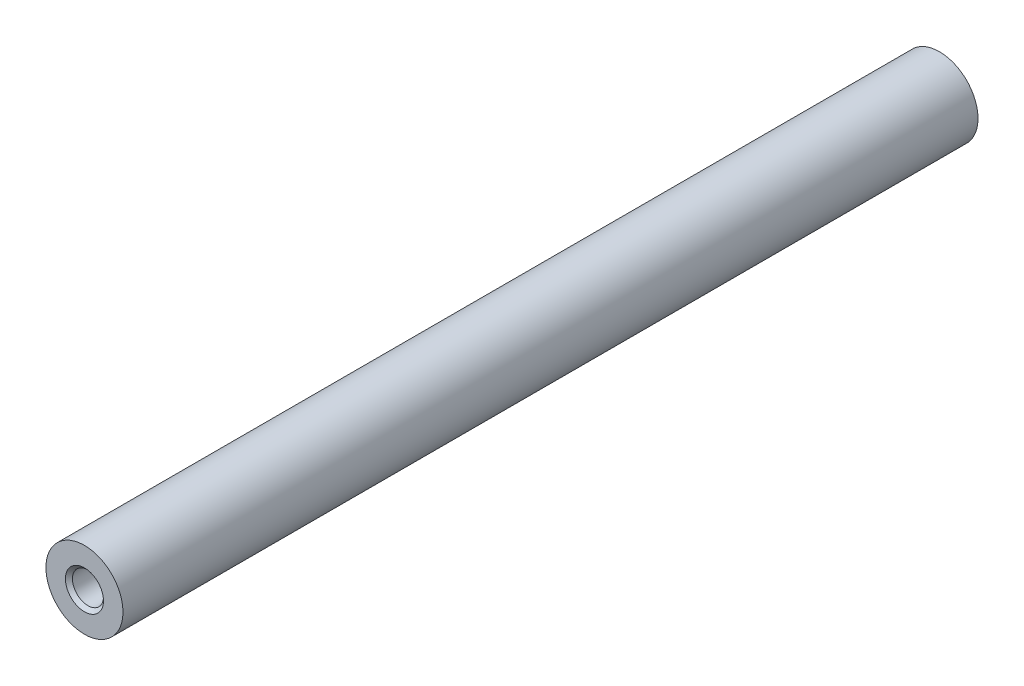
ISO-10303-21;
HEADER;
FILE_DESCRIPTION(('STEP AP214'),'2;1');
FILE_NAME('part.step','',(''),(''),'','','');
FILE_SCHEMA(('AUTOMOTIVE_DESIGN { 1 0 10303 214 1 1 1 1 }'));
ENDSEC;
DATA;
#1=APPLICATION_CONTEXT('core data for automotive mechanical design processes');
#2=APPLICATION_PROTOCOL_DEFINITION('international standard','automotive_design',2000,#1);
#3=PRODUCT_CONTEXT('',#1,'mechanical');
#4=PRODUCT('Part','Part','',(#3));
#5=PRODUCT_RELATED_PRODUCT_CATEGORY('part','',(#4));
#6=PRODUCT_DEFINITION_FORMATION('','',#4);
#7=PRODUCT_DEFINITION_CONTEXT('part definition',#1,'design');
#8=PRODUCT_DEFINITION('design','',#6,#7);
#9=PRODUCT_DEFINITION_SHAPE('','',#8);
#10=(LENGTH_UNIT() NAMED_UNIT(*) SI_UNIT(.MILLI.,.METRE.));
#11=(NAMED_UNIT(*) PLANE_ANGLE_UNIT() SI_UNIT($,.RADIAN.));
#12=(NAMED_UNIT(*) SI_UNIT($,.STERADIAN.) SOLID_ANGLE_UNIT());
#13=UNCERTAINTY_MEASURE_WITH_UNIT(LENGTH_MEASURE(1.E-05),#10,'distance_accuracy_value','');
#14=(GEOMETRIC_REPRESENTATION_CONTEXT(3) GLOBAL_UNCERTAINTY_ASSIGNED_CONTEXT((#13)) GLOBAL_UNIT_ASSIGNED_CONTEXT((#10,
#11,#12)) REPRESENTATION_CONTEXT('',''));
#15=CARTESIAN_POINT('',(0.,0.,0.));
#16=DIRECTION('',(0.,0.,1.));
#17=DIRECTION('',(1.,0.,0.));
#18=AXIS2_PLACEMENT_3D('',#15,#16,#17);
#19=CARTESIAN_POINT('',(-29.0717121826814,179.873872766802,-91.));
#20=DIRECTION('',(0.,0.,-1.));
#21=DIRECTION('',(1.,0.,0.));
#22=AXIS2_PLACEMENT_3D('',#19,#20,#21);
#23=PLANE('',#22);
#24=CARTESIAN_POINT('',(-29.0717121826814,179.873872766802,-91.));
#25=DIRECTION('',(0.,0.,-1.));
#26=DIRECTION('',(-1.,0.,0.));
#27=AXIS2_PLACEMENT_3D('',#24,#25,#26);
#28=CIRCLE('',#27,2.025);
#29=CARTESIAN_POINT('',(-31.0967121826814,179.873872766802,-91.));
#30=VERTEX_POINT('',#29);
#31=EDGE_CURVE('E66',#30,#30,#28,.T.);
#32=ORIENTED_EDGE('',*,*,#31,.F.);
#33=EDGE_LOOP('',(#32));
#34=FACE_BOUND('',#33,.T.);
#35=CARTESIAN_POINT('',(-29.0717121826814,179.873872766802,-91.));
#36=DIRECTION('',(0.,0.,-1.));
#37=DIRECTION('',(-1.,0.,0.));
#38=AXIS2_PLACEMENT_3D('',#35,#36,#37);
#39=CIRCLE('',#38,4.09999999999999);
#40=CARTESIAN_POINT('',(-33.1717121826814,179.873872766802,-91.));
#41=VERTEX_POINT('',#40);
#42=EDGE_CURVE('E11',#41,#41,#39,.F.);
#43=ORIENTED_EDGE('',*,*,#42,.F.);
#44=EDGE_LOOP('',(#43));
#45=FACE_BOUND('',#44,.T.);
#46=ADVANCED_FACE('F36',(#34,#45),#23,.T.);
#47=CARTESIAN_POINT('',(-29.0717121826814,179.873872766802,0.));
#48=DIRECTION('',(0.,0.,1.));
#49=DIRECTION('',(1.,0.,0.));
#50=AXIS2_PLACEMENT_3D('',#47,#48,#49);
#51=PLANE('',#50);
#52=CARTESIAN_POINT('',(-29.0717121826814,179.873872766802,0.));
#53=DIRECTION('',(0.,0.,1.));
#54=DIRECTION('',(1.,0.,0.));
#55=AXIS2_PLACEMENT_3D('',#52,#53,#54);
#56=CIRCLE('',#55,2.025);
#57=CARTESIAN_POINT('',(-27.0467121826814,179.873872766802,0.));
#58=VERTEX_POINT('',#57);
#59=EDGE_CURVE('E59',#58,#58,#56,.T.);
#60=ORIENTED_EDGE('',*,*,#59,.F.);
#61=EDGE_LOOP('',(#60));
#62=FACE_BOUND('',#61,.T.);
#63=CARTESIAN_POINT('',(-29.0717121826814,179.873872766802,0.));
#64=DIRECTION('',(0.,0.,1.));
#65=DIRECTION('',(1.,0.,0.));
#66=AXIS2_PLACEMENT_3D('',#63,#64,#65);
#67=CIRCLE('',#66,4.09999999999999);
#68=CARTESIAN_POINT('',(-24.9717121826814,179.873872766802,0.));
#69=VERTEX_POINT('',#68);
#70=EDGE_CURVE('E43',#69,#69,#67,.T.);
#71=ORIENTED_EDGE('',*,*,#70,.T.);
#72=EDGE_LOOP('',(#71));
#73=FACE_BOUND('',#72,.T.);
#74=ADVANCED_FACE('F77',(#62,#73),#51,.T.);
#75=CARTESIAN_POINT('',(-29.0717121826814,179.873872766802,-102.596551211459));
#76=DIRECTION('',(0.,0.,1.));
#77=DIRECTION('',(1.,0.,0.));
#78=AXIS2_PLACEMENT_3D('',#75,#76,#77);
#79=CYLINDRICAL_SURFACE('',#78,4.09999999999999);
#80=ORIENTED_EDGE('',*,*,#70,.F.);
#81=EDGE_LOOP('',(#80));
#82=FACE_BOUND('',#81,.T.);
#83=ORIENTED_EDGE('',*,*,#42,.T.);
#84=EDGE_LOOP('',(#83));
#85=FACE_BOUND('',#84,.T.);
#86=ADVANCED_FACE('F79',(#82,#85),#79,.T.);
#87=CARTESIAN_POINT('',(-29.0717121826814,179.873872766802,-11.5));
#88=DIRECTION('',(0.,0.,1.));
#89=DIRECTION('',(1.,0.,0.));
#90=AXIS2_PLACEMENT_3D('',#87,#88,#89);
#91=CONICAL_SURFACE('',#90,1.65,1.02974425867665);
#92=CARTESIAN_POINT('',(-29.0717121826814,179.873872766802,-12.4914200213955));
#93=VERTEX_POINT('',#92);
#94=VERTEX_LOOP('',#93);
#95=FACE_BOUND('',#94,.T.);
#96=CARTESIAN_POINT('',(-29.0717121826814,179.873872766802,-11.5));
#97=DIRECTION('',(0.,0.,1.));
#98=DIRECTION('',(1.,0.,0.));
#99=AXIS2_PLACEMENT_3D('',#96,#97,#98);
#100=CIRCLE('',#99,1.65);
#101=CARTESIAN_POINT('',(-27.4217121826814,179.873872766802,-11.5));
#102=VERTEX_POINT('',#101);
#103=EDGE_CURVE('E72',#102,#102,#100,.T.);
#104=ORIENTED_EDGE('',*,*,#103,.T.);
#105=EDGE_LOOP('',(#104));
#106=FACE_BOUND('',#105,.T.);
#107=ADVANCED_FACE('F82',(#95,#106),#91,.F.);
#108=CARTESIAN_POINT('',(-29.0717121826814,179.873872766802,0.));
#109=DIRECTION('',(0.,0.,1.));
#110=DIRECTION('',(1.,0.,0.));
#111=AXIS2_PLACEMENT_3D('',#108,#109,#110);
#112=CYLINDRICAL_SURFACE('',#111,1.65);
#113=ORIENTED_EDGE('',*,*,#103,.F.);
#114=EDGE_LOOP('',(#113));
#115=FACE_BOUND('',#114,.T.);
#116=CARTESIAN_POINT('',(-29.0717121826814,179.873872766802,-0.375000000000004));
#117=DIRECTION('',(0.,0.,1.));
#118=DIRECTION('',(1.,0.,0.));
#119=AXIS2_PLACEMENT_3D('',#116,#117,#118);
#120=CIRCLE('',#119,1.65);
#121=CARTESIAN_POINT('',(-27.4217121826814,179.873872766802,-0.375000000000004));
#122=VERTEX_POINT('',#121);
#123=EDGE_CURVE('E63',#122,#122,#120,.T.);
#124=ORIENTED_EDGE('',*,*,#123,.T.);
#125=EDGE_LOOP('',(#124));
#126=FACE_BOUND('',#125,.T.);
#127=ADVANCED_FACE('F107',(#115,#126),#112,.F.);
#128=CARTESIAN_POINT('',(-29.0717121826814,179.873872766802,0.));
#129=DIRECTION('',(0.,0.,1.));
#130=DIRECTION('',(1.,0.,0.));
#131=AXIS2_PLACEMENT_3D('',#128,#129,#130);
#132=CONICAL_SURFACE('',#131,2.025,0.785398163397446);
#133=ORIENTED_EDGE('',*,*,#123,.F.);
#134=EDGE_LOOP('',(#133));
#135=FACE_BOUND('',#134,.T.);
#136=ORIENTED_EDGE('',*,*,#59,.T.);
#137=EDGE_LOOP('',(#136));
#138=FACE_BOUND('',#137,.T.);
#139=ADVANCED_FACE('F53',(#135,#138),#132,.F.);
#140=CARTESIAN_POINT('',(-29.0717121826814,179.873872766802,-79.5));
#141=DIRECTION('',(0.,0.,-1.));
#142=DIRECTION('',(-1.,0.,0.));
#143=AXIS2_PLACEMENT_3D('',#140,#141,#142);
#144=CONICAL_SURFACE('',#143,1.64999999999999,1.02974425867665);
#145=CARTESIAN_POINT('',(-29.0717121826814,179.873872766802,-78.5085799786045));
#146=VERTEX_POINT('',#145);
#147=VERTEX_LOOP('',#146);
#148=FACE_BOUND('',#147,.T.);
#149=CARTESIAN_POINT('',(-29.0717121826814,179.873872766802,-79.5));
#150=DIRECTION('',(0.,0.,-1.));
#151=DIRECTION('',(-1.,0.,0.));
#152=AXIS2_PLACEMENT_3D('',#149,#150,#151);
#153=CIRCLE('',#152,1.64999999999999);
#154=CARTESIAN_POINT('',(-30.7217121826814,179.873872766802,-79.5));
#155=VERTEX_POINT('',#154);
#156=EDGE_CURVE('E57',#155,#155,#153,.T.);
#157=ORIENTED_EDGE('',*,*,#156,.T.);
#158=EDGE_LOOP('',(#157));
#159=FACE_BOUND('',#158,.T.);
#160=ADVANCED_FACE('F49',(#148,#159),#144,.F.);
#161=CARTESIAN_POINT('',(-29.0717121826814,179.873872766802,-91.));
#162=DIRECTION('',(0.,0.,-1.));
#163=DIRECTION('',(-1.,0.,0.));
#164=AXIS2_PLACEMENT_3D('',#161,#162,#163);
#165=CYLINDRICAL_SURFACE('',#164,1.64999999999999);
#166=ORIENTED_EDGE('',*,*,#156,.F.);
#167=EDGE_LOOP('',(#166));
#168=FACE_BOUND('',#167,.T.);
#169=CARTESIAN_POINT('',(-29.0717121826814,179.873872766802,-90.625));
#170=DIRECTION('',(0.,0.,-1.));
#171=DIRECTION('',(-1.,0.,0.));
#172=AXIS2_PLACEMENT_3D('',#169,#170,#171);
#173=CIRCLE('',#172,1.64999999999999);
#174=CARTESIAN_POINT('',(-30.7217121826814,179.873872766802,-90.625));
#175=VERTEX_POINT('',#174);
#176=EDGE_CURVE('E60',#175,#175,#173,.T.);
#177=ORIENTED_EDGE('',*,*,#176,.T.);
#178=EDGE_LOOP('',(#177));
#179=FACE_BOUND('',#178,.T.);
#180=ADVANCED_FACE('F52',(#168,#179),#165,.F.);
#181=CARTESIAN_POINT('',(-29.0717121826814,179.873872766802,-91.));
#182=DIRECTION('',(0.,0.,-1.));
#183=DIRECTION('',(-1.,0.,0.));
#184=AXIS2_PLACEMENT_3D('',#181,#182,#183);
#185=CONICAL_SURFACE('',#184,2.025,0.785398163397462);
#186=ORIENTED_EDGE('',*,*,#176,.F.);
#187=EDGE_LOOP('',(#186));
#188=FACE_BOUND('',#187,.T.);
#189=ORIENTED_EDGE('',*,*,#31,.T.);
#190=EDGE_LOOP('',(#189));
#191=FACE_BOUND('',#190,.T.);
#192=ADVANCED_FACE('F95',(#188,#191),#185,.F.);
#193=CLOSED_SHELL('',(#46,#74,#86,#107,#127,#139,#160,#180,#192));
#194=MANIFOLD_SOLID_BREP('B2',#193);
#195=ADVANCED_BREP_SHAPE_REPRESENTATION('',(#18,#194),#14);
#196=SHAPE_DEFINITION_REPRESENTATION(#9,#195);
ENDSEC;
END-ISO-10303-21;
